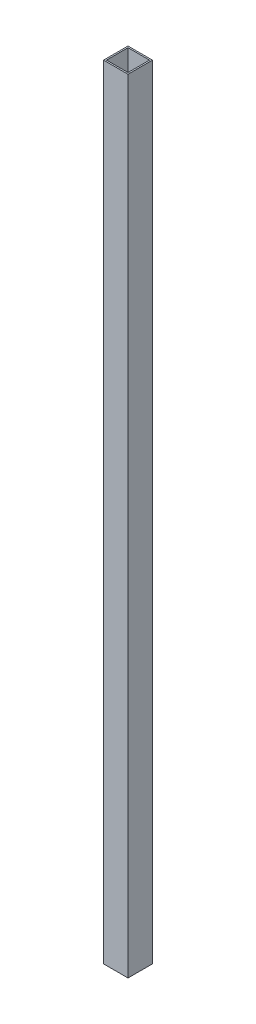
ISO-10303-21;
HEADER;
FILE_DESCRIPTION(('STEP AP214'),'2;1');
FILE_NAME('part.step','',(''),(''),'','','');
FILE_SCHEMA(('AUTOMOTIVE_DESIGN { 1 0 10303 214 1 1 1 1 }'));
ENDSEC;
DATA;
#1=APPLICATION_CONTEXT('core data for automotive mechanical design processes');
#2=APPLICATION_PROTOCOL_DEFINITION('international standard','automotive_design',2000,#1);
#3=PRODUCT_CONTEXT('',#1,'mechanical');
#4=PRODUCT('Part','Part','',(#3));
#5=PRODUCT_RELATED_PRODUCT_CATEGORY('part','',(#4));
#6=PRODUCT_DEFINITION_FORMATION('','',#4);
#7=PRODUCT_DEFINITION_CONTEXT('part definition',#1,'design');
#8=PRODUCT_DEFINITION('design','',#6,#7);
#9=PRODUCT_DEFINITION_SHAPE('','',#8);
#10=(LENGTH_UNIT() NAMED_UNIT(*) SI_UNIT(.MILLI.,.METRE.));
#11=(NAMED_UNIT(*) PLANE_ANGLE_UNIT() SI_UNIT($,.RADIAN.));
#12=(NAMED_UNIT(*) SI_UNIT($,.STERADIAN.) SOLID_ANGLE_UNIT());
#13=UNCERTAINTY_MEASURE_WITH_UNIT(LENGTH_MEASURE(1.E-05),#10,'distance_accuracy_value','');
#14=(GEOMETRIC_REPRESENTATION_CONTEXT(3) GLOBAL_UNCERTAINTY_ASSIGNED_CONTEXT((#13)) GLOBAL_UNIT_ASSIGNED_CONTEXT((#10,
#11,#12)) REPRESENTATION_CONTEXT('',''));
#15=CARTESIAN_POINT('',(0.,0.,0.));
#16=DIRECTION('',(0.,0.,1.));
#17=DIRECTION('',(1.,0.,0.));
#18=AXIS2_PLACEMENT_3D('',#15,#16,#17);
#19=CARTESIAN_POINT('',(0.,400.,0.));
#20=DIRECTION('',(0.,1.,0.));
#21=DIRECTION('',(0.,0.,1.));
#22=AXIS2_PLACEMENT_3D('',#19,#20,#21);
#23=PLANE('',#22);
#24=DIRECTION('',(0.,0.,1.));
#25=VECTOR('',#24,1.);
#26=CARTESIAN_POINT('',(-26.6277544150477,400.,-1.83717263154866));
#27=LINE('',#26,#25);
#28=CARTESIAN_POINT('',(-26.6277544150477,400.,-1.83717263154866));
#29=VERTEX_POINT('',#28);
#30=CARTESIAN_POINT('',(-26.6277544150477,400.,10.6628273684513));
#31=VERTEX_POINT('',#30);
#32=EDGE_CURVE('E138',#29,#31,#27,.T.);
#33=ORIENTED_EDGE('',*,*,#32,.T.);
#34=DIRECTION('',(1.,0.,0.));
#35=VECTOR('',#34,1.);
#36=CARTESIAN_POINT('',(-26.6277544150477,400.,10.6628273684513));
#37=LINE('',#36,#35);
#38=CARTESIAN_POINT('',(-14.1277544150477,400.,10.6628273684513));
#39=VERTEX_POINT('',#38);
#40=EDGE_CURVE('E141',#31,#39,#37,.T.);
#41=ORIENTED_EDGE('',*,*,#40,.T.);
#42=DIRECTION('',(0.,0.,-1.));
#43=VECTOR('',#42,1.);
#44=CARTESIAN_POINT('',(-14.1277544150477,400.,-1.83717263154866));
#45=LINE('',#44,#43);
#46=CARTESIAN_POINT('',(-14.1277544150477,400.,-1.83717263154866));
#47=VERTEX_POINT('',#46);
#48=EDGE_CURVE('E144',#39,#47,#45,.T.);
#49=ORIENTED_EDGE('',*,*,#48,.T.);
#50=DIRECTION('',(-1.,0.,0.));
#51=VECTOR('',#50,1.);
#52=CARTESIAN_POINT('',(-26.6277544150477,400.,-1.83717263154866));
#53=LINE('',#52,#51);
#54=EDGE_CURVE('E146',#47,#29,#53,.T.);
#55=ORIENTED_EDGE('',*,*,#54,.T.);
#56=EDGE_LOOP('',(#33,#41,#49,#55));
#57=FACE_BOUND('',#56,.T.);
#58=DIRECTION('',(-1.,0.,0.));
#59=VECTOR('',#58,1.);
#60=CARTESIAN_POINT('',(-25.8777544150477,400.,-1.08717263154866));
#61=LINE('',#60,#59);
#62=CARTESIAN_POINT('',(-14.8777544150477,400.,-1.08717263154866));
#63=VERTEX_POINT('',#62);
#64=CARTESIAN_POINT('',(-25.8777544150477,400.,-1.08717263154866));
#65=VERTEX_POINT('',#64);
#66=EDGE_CURVE('E110',#63,#65,#61,.T.);
#67=ORIENTED_EDGE('',*,*,#66,.F.);
#68=DIRECTION('',(0.,0.,-1.));
#69=VECTOR('',#68,1.);
#70=CARTESIAN_POINT('',(-14.8777544150477,400.,-1.08717263154866));
#71=LINE('',#70,#69);
#72=CARTESIAN_POINT('',(-14.8777544150477,400.,9.91282736845134));
#73=VERTEX_POINT('',#72);
#74=EDGE_CURVE('E102',#73,#63,#71,.T.);
#75=ORIENTED_EDGE('',*,*,#74,.F.);
#76=DIRECTION('',(1.,0.,0.));
#77=VECTOR('',#76,1.);
#78=CARTESIAN_POINT('',(-25.8777544150477,400.,9.91282736845134));
#79=LINE('',#78,#77);
#80=CARTESIAN_POINT('',(-25.8777544150477,400.,9.91282736845134));
#81=VERTEX_POINT('',#80);
#82=EDGE_CURVE('E124',#81,#73,#79,.T.);
#83=ORIENTED_EDGE('',*,*,#82,.F.);
#84=DIRECTION('',(0.,0.,1.));
#85=VECTOR('',#84,1.);
#86=CARTESIAN_POINT('',(-25.8777544150477,400.,-1.08717263154866));
#87=LINE('',#86,#85);
#88=EDGE_CURVE('E122',#65,#81,#87,.T.);
#89=ORIENTED_EDGE('',*,*,#88,.F.);
#90=EDGE_LOOP('',(#67,#75,#83,#89));
#91=FACE_BOUND('',#90,.T.);
#92=ADVANCED_FACE('F37',(#57,#91),#23,.T.);
#93=CARTESIAN_POINT('',(0.,0.,0.));
#94=DIRECTION('',(0.,1.,0.));
#95=DIRECTION('',(0.,0.,1.));
#96=AXIS2_PLACEMENT_3D('',#93,#94,#95);
#97=PLANE('',#96);
#98=DIRECTION('',(0.,0.,1.));
#99=VECTOR('',#98,1.);
#100=CARTESIAN_POINT('',(-26.6277544150477,0.,-1.83717263154866));
#101=LINE('',#100,#99);
#102=CARTESIAN_POINT('',(-26.6277544150477,0.,-1.83717263154866));
#103=VERTEX_POINT('',#102);
#104=CARTESIAN_POINT('',(-26.6277544150477,0.,10.6628273684513));
#105=VERTEX_POINT('',#104);
#106=EDGE_CURVE('E118',#103,#105,#101,.T.);
#107=ORIENTED_EDGE('',*,*,#106,.F.);
#108=DIRECTION('',(-1.,0.,0.));
#109=VECTOR('',#108,1.);
#110=CARTESIAN_POINT('',(-26.6277544150477,0.,-1.83717263154866));
#111=LINE('',#110,#109);
#112=CARTESIAN_POINT('',(-14.1277544150477,0.,-1.83717263154866));
#113=VERTEX_POINT('',#112);
#114=EDGE_CURVE('E142',#113,#103,#111,.T.);
#115=ORIENTED_EDGE('',*,*,#114,.F.);
#116=DIRECTION('',(0.,0.,-1.));
#117=VECTOR('',#116,1.);
#118=CARTESIAN_POINT('',(-14.1277544150477,0.,-1.83717263154866));
#119=LINE('',#118,#117);
#120=CARTESIAN_POINT('',(-14.1277544150477,0.,10.6628273684513));
#121=VERTEX_POINT('',#120);
#122=EDGE_CURVE('E153',#121,#113,#119,.T.);
#123=ORIENTED_EDGE('',*,*,#122,.F.);
#124=DIRECTION('',(1.,0.,0.));
#125=VECTOR('',#124,1.);
#126=CARTESIAN_POINT('',(-26.6277544150477,0.,10.6628273684513));
#127=LINE('',#126,#125);
#128=EDGE_CURVE('E151',#105,#121,#127,.T.);
#129=ORIENTED_EDGE('',*,*,#128,.F.);
#130=EDGE_LOOP('',(#107,#115,#123,#129));
#131=FACE_BOUND('',#130,.T.);
#132=DIRECTION('',(0.,0.,-1.));
#133=VECTOR('',#132,1.);
#134=CARTESIAN_POINT('',(-14.8777544150477,0.,-1.08717263154866));
#135=LINE('',#134,#133);
#136=CARTESIAN_POINT('',(-14.8777544150477,0.,9.91282736845134));
#137=VERTEX_POINT('',#136);
#138=CARTESIAN_POINT('',(-14.8777544150477,0.,-1.08717263154866));
#139=VERTEX_POINT('',#138);
#140=EDGE_CURVE('E60',#137,#139,#135,.T.);
#141=ORIENTED_EDGE('',*,*,#140,.T.);
#142=DIRECTION('',(-1.,0.,0.));
#143=VECTOR('',#142,1.);
#144=CARTESIAN_POINT('',(-25.8777544150477,0.,-1.08717263154866));
#145=LINE('',#144,#143);
#146=CARTESIAN_POINT('',(-25.8777544150477,0.,-1.08717263154866));
#147=VERTEX_POINT('',#146);
#148=EDGE_CURVE('E117',#139,#147,#145,.T.);
#149=ORIENTED_EDGE('',*,*,#148,.T.);
#150=DIRECTION('',(0.,0.,1.));
#151=VECTOR('',#150,1.);
#152=CARTESIAN_POINT('',(-25.8777544150477,0.,-1.08717263154866));
#153=LINE('',#152,#151);
#154=CARTESIAN_POINT('',(-25.8777544150477,0.,9.91282736845134));
#155=VERTEX_POINT('',#154);
#156=EDGE_CURVE('E130',#147,#155,#153,.T.);
#157=ORIENTED_EDGE('',*,*,#156,.T.);
#158=DIRECTION('',(1.,0.,0.));
#159=VECTOR('',#158,1.);
#160=CARTESIAN_POINT('',(-25.8777544150477,0.,9.91282736845134));
#161=LINE('',#160,#159);
#162=EDGE_CURVE('E111',#155,#137,#161,.T.);
#163=ORIENTED_EDGE('',*,*,#162,.T.);
#164=EDGE_LOOP('',(#141,#149,#157,#163));
#165=FACE_BOUND('',#164,.T.);
#166=ADVANCED_FACE('F171',(#131,#165),#97,.F.);
#167=CARTESIAN_POINT('',(-26.6277544150477,400.,-1.83717263154866));
#168=DIRECTION('',(1.,0.,0.));
#169=DIRECTION('',(0.,0.,-1.));
#170=AXIS2_PLACEMENT_3D('',#167,#168,#169);
#171=PLANE('',#170);
#172=ORIENTED_EDGE('',*,*,#106,.T.);
#173=DIRECTION('',(0.,-1.,0.));
#174=VECTOR('',#173,1.);
#175=CARTESIAN_POINT('',(-26.6277544150477,400.,10.6628273684513));
#176=LINE('',#175,#174);
#177=EDGE_CURVE('E11',#31,#105,#176,.T.);
#178=ORIENTED_EDGE('',*,*,#177,.F.);
#179=ORIENTED_EDGE('',*,*,#32,.F.);
#180=DIRECTION('',(0.,-1.,0.));
#181=VECTOR('',#180,1.);
#182=CARTESIAN_POINT('',(-26.6277544150477,400.,-1.83717263154866));
#183=LINE('',#182,#181);
#184=EDGE_CURVE('E148',#29,#103,#183,.T.);
#185=ORIENTED_EDGE('',*,*,#184,.T.);
#186=EDGE_LOOP('',(#172,#178,#179,#185));
#187=FACE_BOUND('',#186,.T.);
#188=ADVANCED_FACE('F39',(#187),#171,.F.);
#189=CARTESIAN_POINT('',(-26.6277544150477,400.,10.6628273684513));
#190=DIRECTION('',(0.,0.,-1.));
#191=DIRECTION('',(-1.,0.,0.));
#192=AXIS2_PLACEMENT_3D('',#189,#190,#191);
#193=PLANE('',#192);
#194=ORIENTED_EDGE('',*,*,#128,.T.);
#195=DIRECTION('',(0.,-1.,0.));
#196=VECTOR('',#195,1.);
#197=CARTESIAN_POINT('',(-14.1277544150477,400.,10.6628273684513));
#198=LINE('',#197,#196);
#199=EDGE_CURVE('E45',#39,#121,#198,.T.);
#200=ORIENTED_EDGE('',*,*,#199,.F.);
#201=ORIENTED_EDGE('',*,*,#40,.F.);
#202=ORIENTED_EDGE('',*,*,#177,.T.);
#203=EDGE_LOOP('',(#194,#200,#201,#202));
#204=FACE_BOUND('',#203,.T.);
#205=ADVANCED_FACE('F181',(#204),#193,.F.);
#206=CARTESIAN_POINT('',(-14.1277544150477,400.,-1.83717263154866));
#207=DIRECTION('',(-1.,0.,0.));
#208=DIRECTION('',(0.,0.,1.));
#209=AXIS2_PLACEMENT_3D('',#206,#207,#208);
#210=PLANE('',#209);
#211=ORIENTED_EDGE('',*,*,#122,.T.);
#212=DIRECTION('',(0.,-1.,0.));
#213=VECTOR('',#212,1.);
#214=CARTESIAN_POINT('',(-14.1277544150477,400.,-1.83717263154866));
#215=LINE('',#214,#213);
#216=EDGE_CURVE('E158',#47,#113,#215,.T.);
#217=ORIENTED_EDGE('',*,*,#216,.F.);
#218=ORIENTED_EDGE('',*,*,#48,.F.);
#219=ORIENTED_EDGE('',*,*,#199,.T.);
#220=EDGE_LOOP('',(#211,#217,#218,#219));
#221=FACE_BOUND('',#220,.T.);
#222=ADVANCED_FACE('F165',(#221),#210,.F.);
#223=CARTESIAN_POINT('',(-26.6277544150477,400.,-1.83717263154866));
#224=DIRECTION('',(0.,0.,1.));
#225=DIRECTION('',(1.,0.,0.));
#226=AXIS2_PLACEMENT_3D('',#223,#224,#225);
#227=PLANE('',#226);
#228=ORIENTED_EDGE('',*,*,#114,.T.);
#229=ORIENTED_EDGE('',*,*,#184,.F.);
#230=ORIENTED_EDGE('',*,*,#54,.F.);
#231=ORIENTED_EDGE('',*,*,#216,.T.);
#232=EDGE_LOOP('',(#228,#229,#230,#231));
#233=FACE_BOUND('',#232,.T.);
#234=ADVANCED_FACE('F175',(#233),#227,.F.);
#235=CARTESIAN_POINT('',(-14.8777544150477,400.,-1.08717263154866));
#236=DIRECTION('',(-1.,0.,0.));
#237=DIRECTION('',(0.,0.,1.));
#238=AXIS2_PLACEMENT_3D('',#235,#236,#237);
#239=PLANE('',#238);
#240=ORIENTED_EDGE('',*,*,#140,.F.);
#241=DIRECTION('',(0.,-1.,0.));
#242=VECTOR('',#241,1.);
#243=CARTESIAN_POINT('',(-14.8777544150477,400.,9.91282736845134));
#244=LINE('',#243,#242);
#245=EDGE_CURVE('E106',#73,#137,#244,.T.);
#246=ORIENTED_EDGE('',*,*,#245,.F.);
#247=ORIENTED_EDGE('',*,*,#74,.T.);
#248=DIRECTION('',(0.,-1.,0.));
#249=VECTOR('',#248,1.);
#250=CARTESIAN_POINT('',(-14.8777544150477,400.,-1.08717263154866));
#251=LINE('',#250,#249);
#252=EDGE_CURVE('E105',#63,#139,#251,.T.);
#253=ORIENTED_EDGE('',*,*,#252,.T.);
#254=EDGE_LOOP('',(#240,#246,#247,#253));
#255=FACE_BOUND('',#254,.T.);
#256=ADVANCED_FACE('F104',(#255),#239,.T.);
#257=CARTESIAN_POINT('',(-25.8777544150477,400.,-1.08717263154866));
#258=DIRECTION('',(0.,0.,1.));
#259=DIRECTION('',(1.,0.,0.));
#260=AXIS2_PLACEMENT_3D('',#257,#258,#259);
#261=PLANE('',#260);
#262=ORIENTED_EDGE('',*,*,#148,.F.);
#263=ORIENTED_EDGE('',*,*,#252,.F.);
#264=ORIENTED_EDGE('',*,*,#66,.T.);
#265=DIRECTION('',(0.,-1.,0.));
#266=VECTOR('',#265,1.);
#267=CARTESIAN_POINT('',(-25.8777544150477,400.,-1.08717263154866));
#268=LINE('',#267,#266);
#269=EDGE_CURVE('E119',#65,#147,#268,.T.);
#270=ORIENTED_EDGE('',*,*,#269,.T.);
#271=EDGE_LOOP('',(#262,#263,#264,#270));
#272=FACE_BOUND('',#271,.T.);
#273=ADVANCED_FACE('F114',(#272),#261,.T.);
#274=CARTESIAN_POINT('',(-25.8777544150477,400.,-1.08717263154866));
#275=DIRECTION('',(1.,0.,0.));
#276=DIRECTION('',(0.,0.,-1.));
#277=AXIS2_PLACEMENT_3D('',#274,#275,#276);
#278=PLANE('',#277);
#279=ORIENTED_EDGE('',*,*,#156,.F.);
#280=ORIENTED_EDGE('',*,*,#269,.F.);
#281=ORIENTED_EDGE('',*,*,#88,.T.);
#282=DIRECTION('',(0.,-1.,0.));
#283=VECTOR('',#282,1.);
#284=CARTESIAN_POINT('',(-25.8777544150477,400.,9.91282736845134));
#285=LINE('',#284,#283);
#286=EDGE_CURVE('E52',#81,#155,#285,.T.);
#287=ORIENTED_EDGE('',*,*,#286,.T.);
#288=EDGE_LOOP('',(#279,#280,#281,#287));
#289=FACE_BOUND('',#288,.T.);
#290=ADVANCED_FACE('F204',(#289),#278,.T.);
#291=CARTESIAN_POINT('',(-25.8777544150477,400.,9.91282736845134));
#292=DIRECTION('',(0.,0.,-1.));
#293=DIRECTION('',(-1.,0.,0.));
#294=AXIS2_PLACEMENT_3D('',#291,#292,#293);
#295=PLANE('',#294);
#296=ORIENTED_EDGE('',*,*,#162,.F.);
#297=ORIENTED_EDGE('',*,*,#286,.F.);
#298=ORIENTED_EDGE('',*,*,#82,.T.);
#299=ORIENTED_EDGE('',*,*,#245,.T.);
#300=EDGE_LOOP('',(#296,#297,#298,#299));
#301=FACE_BOUND('',#300,.T.);
#302=ADVANCED_FACE('F208',(#301),#295,.T.);
#303=CLOSED_SHELL('',(#92,#166,#188,#205,#222,#234,#256,#273,#290,#302));
#304=MANIFOLD_SOLID_BREP('B2',#303);
#305=ADVANCED_BREP_SHAPE_REPRESENTATION('',(#18,#304),#14);
#306=SHAPE_DEFINITION_REPRESENTATION(#9,#305);
ENDSEC;
END-ISO-10303-21;
